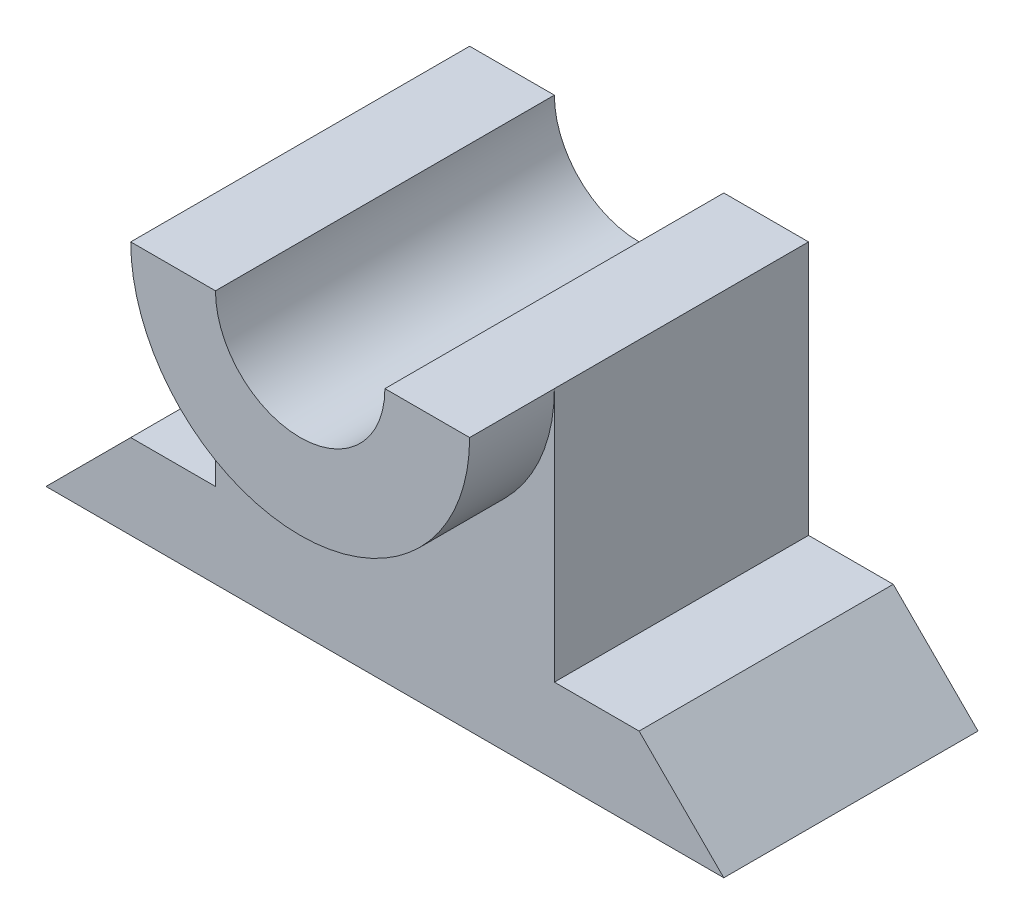
ISO-10303-21;
HEADER;
FILE_DESCRIPTION(('STEP AP214'),'2;1');
FILE_NAME('part.step','',(''),(''),'','','');
FILE_SCHEMA(('AUTOMOTIVE_DESIGN { 1 0 10303 214 1 1 1 1 }'));
ENDSEC;
DATA;
#1=APPLICATION_CONTEXT('core data for automotive mechanical design processes');
#2=APPLICATION_PROTOCOL_DEFINITION('international standard','automotive_design',2000,#1);
#3=PRODUCT_CONTEXT('',#1,'mechanical');
#4=PRODUCT('Part','Part','',(#3));
#5=PRODUCT_RELATED_PRODUCT_CATEGORY('part','',(#4));
#6=PRODUCT_DEFINITION_FORMATION('','',#4);
#7=PRODUCT_DEFINITION_CONTEXT('part definition',#1,'design');
#8=PRODUCT_DEFINITION('design','',#6,#7);
#9=PRODUCT_DEFINITION_SHAPE('','',#8);
#10=(LENGTH_UNIT() NAMED_UNIT(*) SI_UNIT(.MILLI.,.METRE.));
#11=(NAMED_UNIT(*) PLANE_ANGLE_UNIT() SI_UNIT($,.RADIAN.));
#12=(NAMED_UNIT(*) SI_UNIT($,.STERADIAN.) SOLID_ANGLE_UNIT());
#13=UNCERTAINTY_MEASURE_WITH_UNIT(LENGTH_MEASURE(1.E-05),#10,'distance_accuracy_value','');
#14=(GEOMETRIC_REPRESENTATION_CONTEXT(3) GLOBAL_UNCERTAINTY_ASSIGNED_CONTEXT((#13)) GLOBAL_UNIT_ASSIGNED_CONTEXT((#10,
#11,#12)) REPRESENTATION_CONTEXT('',''));
#15=CARTESIAN_POINT('',(0.,0.,0.));
#16=DIRECTION('',(0.,0.,1.));
#17=DIRECTION('',(1.,0.,0.));
#18=AXIS2_PLACEMENT_3D('',#15,#16,#17);
#19=CARTESIAN_POINT('',(0.,1016.,1016.));
#20=DIRECTION('',(0.,0.,-1.));
#21=DIRECTION('',(-1.,0.,0.));
#22=AXIS2_PLACEMENT_3D('',#19,#20,#21);
#23=CYLINDRICAL_SURFACE('',#22,508.);
#24=CARTESIAN_POINT('',(0.,1016.,762.));
#25=DIRECTION('',(0.,0.,1.));
#26=DIRECTION('',(1.,0.,0.));
#27=AXIS2_PLACEMENT_3D('',#24,#25,#26);
#28=CIRCLE('',#27,508.);
#29=CARTESIAN_POINT('',(508.,1016.,762.));
#30=VERTEX_POINT('',#29);
#31=CARTESIAN_POINT('',(-508.,1016.,762.));
#32=VERTEX_POINT('',#31);
#33=EDGE_CURVE('E188',#30,#32,#28,.F.);
#34=ORIENTED_EDGE('',*,*,#33,.F.);
#35=DIRECTION('',(0.,0.,-1.));
#36=VECTOR('',#35,1.);
#37=CARTESIAN_POINT('',(508.,1016.,1016.));
#38=LINE('',#37,#36);
#39=CARTESIAN_POINT('',(508.,1016.,1016.));
#40=VERTEX_POINT('',#39);
#41=EDGE_CURVE('E11',#40,#30,#38,.T.);
#42=ORIENTED_EDGE('',*,*,#41,.F.);
#43=CARTESIAN_POINT('',(0.,1016.,1016.));
#44=DIRECTION('',(0.,0.,1.));
#45=DIRECTION('',(1.,0.,0.));
#46=AXIS2_PLACEMENT_3D('',#43,#44,#45);
#47=CIRCLE('',#46,508.);
#48=CARTESIAN_POINT('',(-508.,1016.,1016.));
#49=VERTEX_POINT('',#48);
#50=EDGE_CURVE('E159',#40,#49,#47,.F.);
#51=ORIENTED_EDGE('',*,*,#50,.T.);
#52=DIRECTION('',(0.,0.,-1.));
#53=VECTOR('',#52,1.);
#54=CARTESIAN_POINT('',(-508.,1016.,1016.));
#55=LINE('',#54,#53);
#56=EDGE_CURVE('E49',#49,#32,#55,.T.);
#57=ORIENTED_EDGE('',*,*,#56,.T.);
#58=EDGE_LOOP('',(#34,#42,#51,#57));
#59=FACE_BOUND('',#58,.T.);
#60=ADVANCED_FACE('F33',(#59),#23,.T.);
#61=CARTESIAN_POINT('',(2.66453525910038E-12,1016.,1016.));
#62=DIRECTION('',(0.,-1.,0.));
#63=DIRECTION('',(1.,0.,0.));
#64=AXIS2_PLACEMENT_3D('',#61,#62,#63);
#65=PLANE('',#64);
#66=DIRECTION('',(-1.,0.,0.));
#67=VECTOR('',#66,1.);
#68=CARTESIAN_POINT('',(2.66453525910038E-12,1016.,0.));
#69=LINE('',#68,#67);
#70=CARTESIAN_POINT('',(508.,1016.,0.));
#71=VERTEX_POINT('',#70);
#72=CARTESIAN_POINT('',(254.,1016.,0.));
#73=VERTEX_POINT('',#72);
#74=EDGE_CURVE('E151',#71,#73,#69,.T.);
#75=ORIENTED_EDGE('',*,*,#74,.T.);
#76=DIRECTION('',(0.,0.,-1.));
#77=VECTOR('',#76,1.);
#78=CARTESIAN_POINT('',(254.,1016.,1016.));
#79=LINE('',#78,#77);
#80=CARTESIAN_POINT('',(254.,1016.,1016.));
#81=VERTEX_POINT('',#80);
#82=EDGE_CURVE('E41',#81,#73,#79,.T.);
#83=ORIENTED_EDGE('',*,*,#82,.F.);
#84=DIRECTION('',(-1.,0.,0.));
#85=VECTOR('',#84,1.);
#86=CARTESIAN_POINT('',(2.66453525910038E-12,1016.,1016.));
#87=LINE('',#86,#85);
#88=EDGE_CURVE('E161',#40,#81,#87,.T.);
#89=ORIENTED_EDGE('',*,*,#88,.F.);
#90=ORIENTED_EDGE('',*,*,#41,.T.);
#91=DIRECTION('',(0.,0.,-1.));
#92=VECTOR('',#91,1.);
#93=CARTESIAN_POINT('',(508.,1016.,762.));
#94=LINE('',#93,#92);
#95=EDGE_CURVE('E185',#30,#71,#94,.T.);
#96=ORIENTED_EDGE('',*,*,#95,.T.);
#97=EDGE_LOOP('',(#75,#83,#89,#90,#96));
#98=FACE_BOUND('',#97,.T.);
#99=ADVANCED_FACE('F193',(#98),#65,.F.);
#100=CARTESIAN_POINT('',(0.,1016.,1016.));
#101=DIRECTION('',(0.,0.,-1.));
#102=DIRECTION('',(-1.,0.,0.));
#103=AXIS2_PLACEMENT_3D('',#100,#101,#102);
#104=CYLINDRICAL_SURFACE('',#103,254.);
#105=CARTESIAN_POINT('',(0.,1016.,0.));
#106=DIRECTION('',(0.,0.,1.));
#107=DIRECTION('',(1.,0.,0.));
#108=AXIS2_PLACEMENT_3D('',#105,#106,#107);
#109=CIRCLE('',#108,254.);
#110=CARTESIAN_POINT('',(-254.,1016.,0.));
#111=VERTEX_POINT('',#110);
#112=EDGE_CURVE('E153',#73,#111,#109,.F.);
#113=ORIENTED_EDGE('',*,*,#112,.T.);
#114=DIRECTION('',(0.,0.,-1.));
#115=VECTOR('',#114,1.);
#116=CARTESIAN_POINT('',(-254.,1016.,1016.));
#117=LINE('',#116,#115);
#118=CARTESIAN_POINT('',(-254.,1016.,1016.));
#119=VERTEX_POINT('',#118);
#120=EDGE_CURVE('E63',#119,#111,#117,.T.);
#121=ORIENTED_EDGE('',*,*,#120,.F.);
#122=CARTESIAN_POINT('',(0.,1016.,1016.));
#123=DIRECTION('',(0.,0.,1.));
#124=DIRECTION('',(1.,0.,0.));
#125=AXIS2_PLACEMENT_3D('',#122,#123,#124);
#126=CIRCLE('',#125,254.);
#127=EDGE_CURVE('E164',#81,#119,#126,.F.);
#128=ORIENTED_EDGE('',*,*,#127,.F.);
#129=ORIENTED_EDGE('',*,*,#82,.T.);
#130=EDGE_LOOP('',(#113,#121,#128,#129));
#131=FACE_BOUND('',#130,.T.);
#132=ADVANCED_FACE('F176',(#131),#104,.F.);
#133=CARTESIAN_POINT('',(-1.77635683940025E-12,1016.,1016.));
#134=DIRECTION('',(0.,1.,0.));
#135=DIRECTION('',(-1.,0.,0.));
#136=AXIS2_PLACEMENT_3D('',#133,#134,#135);
#137=PLANE('',#136);
#138=DIRECTION('',(1.,0.,0.));
#139=VECTOR('',#138,1.);
#140=CARTESIAN_POINT('',(-1.77635683940025E-12,1016.,0.));
#141=LINE('',#140,#139);
#142=CARTESIAN_POINT('',(-508.,1016.,0.));
#143=VERTEX_POINT('',#142);
#144=EDGE_CURVE('E162',#143,#111,#141,.T.);
#145=ORIENTED_EDGE('',*,*,#144,.F.);
#146=DIRECTION('',(0.,0.,-1.));
#147=VECTOR('',#146,1.);
#148=CARTESIAN_POINT('',(-508.,1016.,762.));
#149=LINE('',#148,#147);
#150=EDGE_CURVE('E182',#32,#143,#149,.T.);
#151=ORIENTED_EDGE('',*,*,#150,.F.);
#152=ORIENTED_EDGE('',*,*,#56,.F.);
#153=DIRECTION('',(1.,0.,0.));
#154=VECTOR('',#153,1.);
#155=CARTESIAN_POINT('',(-1.77635683940025E-12,1016.,1016.));
#156=LINE('',#155,#154);
#157=EDGE_CURVE('E166',#49,#119,#156,.T.);
#158=ORIENTED_EDGE('',*,*,#157,.T.);
#159=ORIENTED_EDGE('',*,*,#120,.T.);
#160=EDGE_LOOP('',(#145,#151,#152,#158,#159));
#161=FACE_BOUND('',#160,.T.);
#162=ADVANCED_FACE('F181',(#161),#137,.T.);
#163=CARTESIAN_POINT('',(0.,0.,1016.));
#164=DIRECTION('',(0.,0.,1.));
#165=DIRECTION('',(1.,0.,0.));
#166=AXIS2_PLACEMENT_3D('',#163,#164,#165);
#167=PLANE('',#166);
#168=ORIENTED_EDGE('',*,*,#50,.F.);
#169=ORIENTED_EDGE('',*,*,#88,.T.);
#170=ORIENTED_EDGE('',*,*,#127,.T.);
#171=ORIENTED_EDGE('',*,*,#157,.F.);
#172=EDGE_LOOP('',(#168,#169,#170,#171));
#173=FACE_BOUND('',#172,.T.);
#174=ADVANCED_FACE('F192',(#173),#167,.T.);
#175=CARTESIAN_POINT('',(0.,0.,0.));
#176=DIRECTION('',(0.,0.,1.));
#177=DIRECTION('',(1.,0.,0.));
#178=AXIS2_PLACEMENT_3D('',#175,#176,#177);
#179=PLANE('',#178);
#180=ORIENTED_EDGE('',*,*,#74,.F.);
#181=DIRECTION('',(0.,1.,0.));
#182=VECTOR('',#181,1.);
#183=CARTESIAN_POINT('',(508.,0.,0.));
#184=LINE('',#183,#182);
#185=CARTESIAN_POINT('',(508.,254.,0.));
#186=VERTEX_POINT('',#185);
#187=EDGE_CURVE('E211',#186,#71,#184,.T.);
#188=ORIENTED_EDGE('',*,*,#187,.F.);
#189=DIRECTION('',(-1.,0.,0.));
#190=VECTOR('',#189,1.);
#191=CARTESIAN_POINT('',(0.,254.,0.));
#192=LINE('',#191,#190);
#193=CARTESIAN_POINT('',(761.999999999997,254.,0.));
#194=VERTEX_POINT('',#193);
#195=EDGE_CURVE('E213',#194,#186,#192,.T.);
#196=ORIENTED_EDGE('',*,*,#195,.F.);
#197=DIRECTION('',(-0.707106781186551,0.707106781186544,0.));
#198=VECTOR('',#197,1.);
#199=CARTESIAN_POINT('',(507.999999999995,508.,0.));
#200=LINE('',#199,#198);
#201=CARTESIAN_POINT('',(1016.,0.,0.));
#202=VERTEX_POINT('',#201);
#203=EDGE_CURVE('E215',#202,#194,#200,.T.);
#204=ORIENTED_EDGE('',*,*,#203,.F.);
#205=DIRECTION('',(1.,0.,0.));
#206=VECTOR('',#205,1.);
#207=CARTESIAN_POINT('',(0.,0.,0.));
#208=LINE('',#207,#206);
#209=CARTESIAN_POINT('',(-1016.,0.,0.));
#210=VERTEX_POINT('',#209);
#211=EDGE_CURVE('E150',#210,#202,#208,.T.);
#212=ORIENTED_EDGE('',*,*,#211,.F.);
#213=DIRECTION('',(0.707106781186551,0.707106781186544,0.));
#214=VECTOR('',#213,1.);
#215=CARTESIAN_POINT('',(-507.999999999995,508.,0.));
#216=LINE('',#215,#214);
#217=CARTESIAN_POINT('',(-761.999999999997,254.,0.));
#218=VERTEX_POINT('',#217);
#219=EDGE_CURVE('E146',#210,#218,#216,.T.);
#220=ORIENTED_EDGE('',*,*,#219,.T.);
#221=DIRECTION('',(1.,0.,0.));
#222=VECTOR('',#221,1.);
#223=CARTESIAN_POINT('',(0.,254.,0.));
#224=LINE('',#223,#222);
#225=CARTESIAN_POINT('',(-508.,254.,0.));
#226=VERTEX_POINT('',#225);
#227=EDGE_CURVE('E208',#218,#226,#224,.T.);
#228=ORIENTED_EDGE('',*,*,#227,.T.);
#229=DIRECTION('',(0.,1.,0.));
#230=VECTOR('',#229,1.);
#231=CARTESIAN_POINT('',(-508.,0.,0.));
#232=LINE('',#231,#230);
#233=EDGE_CURVE('E71',#226,#143,#232,.T.);
#234=ORIENTED_EDGE('',*,*,#233,.T.);
#235=ORIENTED_EDGE('',*,*,#144,.T.);
#236=ORIENTED_EDGE('',*,*,#112,.F.);
#237=EDGE_LOOP('',(#180,#188,#196,#204,#212,#220,#228,#234,#235,#236));
#238=FACE_BOUND('',#237,.T.);
#239=ADVANCED_FACE('F179',(#238),#179,.F.);
#240=CARTESIAN_POINT('',(0.,0.,762.));
#241=DIRECTION('',(0.,1.,0.));
#242=DIRECTION('',(0.,0.,1.));
#243=AXIS2_PLACEMENT_3D('',#240,#241,#242);
#244=PLANE('',#243);
#245=ORIENTED_EDGE('',*,*,#211,.T.);
#246=DIRECTION('',(0.,0.,-1.));
#247=VECTOR('',#246,1.);
#248=CARTESIAN_POINT('',(1016.,0.,762.));
#249=LINE('',#248,#247);
#250=CARTESIAN_POINT('',(1016.,0.,762.));
#251=VERTEX_POINT('',#250);
#252=EDGE_CURVE('E130',#251,#202,#249,.T.);
#253=ORIENTED_EDGE('',*,*,#252,.F.);
#254=DIRECTION('',(1.,0.,0.));
#255=VECTOR('',#254,1.);
#256=CARTESIAN_POINT('',(0.,0.,762.));
#257=LINE('',#256,#255);
#258=CARTESIAN_POINT('',(-1016.,0.,762.));
#259=VERTEX_POINT('',#258);
#260=EDGE_CURVE('E137',#259,#251,#257,.T.);
#261=ORIENTED_EDGE('',*,*,#260,.F.);
#262=DIRECTION('',(0.,0.,-1.));
#263=VECTOR('',#262,1.);
#264=CARTESIAN_POINT('',(-1016.,0.,762.));
#265=LINE('',#264,#263);
#266=EDGE_CURVE('E204',#259,#210,#265,.T.);
#267=ORIENTED_EDGE('',*,*,#266,.T.);
#268=EDGE_LOOP('',(#245,#253,#261,#267));
#269=FACE_BOUND('',#268,.T.);
#270=ADVANCED_FACE('F148',(#269),#244,.F.);
#271=CARTESIAN_POINT('',(507.999999999995,508.,762.));
#272=DIRECTION('',(-0.707106781186544,-0.707106781186551,0.));
#273=DIRECTION('',(0.707106781186551,-0.707106781186544,0.));
#274=AXIS2_PLACEMENT_3D('',#271,#272,#273);
#275=PLANE('',#274);
#276=ORIENTED_EDGE('',*,*,#203,.T.);
#277=DIRECTION('',(0.,0.,-1.));
#278=VECTOR('',#277,1.);
#279=CARTESIAN_POINT('',(761.999999999997,254.,762.));
#280=LINE('',#279,#278);
#281=CARTESIAN_POINT('',(761.999999999997,254.,762.));
#282=VERTEX_POINT('',#281);
#283=EDGE_CURVE('E133',#282,#194,#280,.T.);
#284=ORIENTED_EDGE('',*,*,#283,.F.);
#285=DIRECTION('',(-0.707106781186551,0.707106781186544,0.));
#286=VECTOR('',#285,1.);
#287=CARTESIAN_POINT('',(507.999999999995,508.,762.));
#288=LINE('',#287,#286);
#289=EDGE_CURVE('E126',#251,#282,#288,.T.);
#290=ORIENTED_EDGE('',*,*,#289,.F.);
#291=ORIENTED_EDGE('',*,*,#252,.T.);
#292=EDGE_LOOP('',(#276,#284,#290,#291));
#293=FACE_BOUND('',#292,.T.);
#294=ADVANCED_FACE('F128',(#293),#275,.F.);
#295=CARTESIAN_POINT('',(0.,254.,762.));
#296=DIRECTION('',(0.,-1.,0.));
#297=DIRECTION('',(0.,0.,-1.));
#298=AXIS2_PLACEMENT_3D('',#295,#296,#297);
#299=PLANE('',#298);
#300=ORIENTED_EDGE('',*,*,#195,.T.);
#301=DIRECTION('',(0.,0.,-1.));
#302=VECTOR('',#301,1.);
#303=CARTESIAN_POINT('',(508.,254.,762.));
#304=LINE('',#303,#302);
#305=CARTESIAN_POINT('',(508.,254.,762.));
#306=VERTEX_POINT('',#305);
#307=EDGE_CURVE('E155',#306,#186,#304,.T.);
#308=ORIENTED_EDGE('',*,*,#307,.F.);
#309=DIRECTION('',(-1.,0.,0.));
#310=VECTOR('',#309,1.);
#311=CARTESIAN_POINT('',(0.,254.,762.));
#312=LINE('',#311,#310);
#313=EDGE_CURVE('E136',#282,#306,#312,.T.);
#314=ORIENTED_EDGE('',*,*,#313,.F.);
#315=ORIENTED_EDGE('',*,*,#283,.T.);
#316=EDGE_LOOP('',(#300,#308,#314,#315));
#317=FACE_BOUND('',#316,.T.);
#318=ADVANCED_FACE('F229',(#317),#299,.F.);
#319=CARTESIAN_POINT('',(508.,0.,762.));
#320=DIRECTION('',(-1.,0.,0.));
#321=DIRECTION('',(0.,0.,1.));
#322=AXIS2_PLACEMENT_3D('',#319,#320,#321);
#323=PLANE('',#322);
#324=ORIENTED_EDGE('',*,*,#187,.T.);
#325=ORIENTED_EDGE('',*,*,#95,.F.);
#326=DIRECTION('',(0.,1.,0.));
#327=VECTOR('',#326,1.);
#328=CARTESIAN_POINT('',(508.,0.,762.));
#329=LINE('',#328,#327);
#330=EDGE_CURVE('E225',#306,#30,#329,.T.);
#331=ORIENTED_EDGE('',*,*,#330,.F.);
#332=ORIENTED_EDGE('',*,*,#307,.T.);
#333=EDGE_LOOP('',(#324,#325,#331,#332));
#334=FACE_BOUND('',#333,.T.);
#335=ADVANCED_FACE('F231',(#334),#323,.F.);
#336=CARTESIAN_POINT('',(-508.,0.,762.));
#337=DIRECTION('',(-1.,0.,0.));
#338=DIRECTION('',(0.,0.,1.));
#339=AXIS2_PLACEMENT_3D('',#336,#337,#338);
#340=PLANE('',#339);
#341=ORIENTED_EDGE('',*,*,#233,.F.);
#342=DIRECTION('',(0.,0.,-1.));
#343=VECTOR('',#342,1.);
#344=CARTESIAN_POINT('',(-508.,254.,762.));
#345=LINE('',#344,#343);
#346=CARTESIAN_POINT('',(-508.,254.,762.));
#347=VERTEX_POINT('',#346);
#348=EDGE_CURVE('E186',#347,#226,#345,.T.);
#349=ORIENTED_EDGE('',*,*,#348,.F.);
#350=DIRECTION('',(0.,1.,0.));
#351=VECTOR('',#350,1.);
#352=CARTESIAN_POINT('',(-508.,0.,762.));
#353=LINE('',#352,#351);
#354=EDGE_CURVE('E222',#347,#32,#353,.T.);
#355=ORIENTED_EDGE('',*,*,#354,.T.);
#356=ORIENTED_EDGE('',*,*,#150,.T.);
#357=EDGE_LOOP('',(#341,#349,#355,#356));
#358=FACE_BOUND('',#357,.T.);
#359=ADVANCED_FACE('F233',(#358),#340,.T.);
#360=CARTESIAN_POINT('',(0.,254.,762.));
#361=DIRECTION('',(0.,1.,0.));
#362=DIRECTION('',(0.,0.,1.));
#363=AXIS2_PLACEMENT_3D('',#360,#361,#362);
#364=PLANE('',#363);
#365=ORIENTED_EDGE('',*,*,#227,.F.);
#366=DIRECTION('',(0.,0.,-1.));
#367=VECTOR('',#366,1.);
#368=CARTESIAN_POINT('',(-761.999999999997,254.,762.));
#369=LINE('',#368,#367);
#370=CARTESIAN_POINT('',(-761.999999999997,254.,762.));
#371=VERTEX_POINT('',#370);
#372=EDGE_CURVE('E202',#371,#218,#369,.T.);
#373=ORIENTED_EDGE('',*,*,#372,.F.);
#374=DIRECTION('',(1.,0.,0.));
#375=VECTOR('',#374,1.);
#376=CARTESIAN_POINT('',(0.,254.,762.));
#377=LINE('',#376,#375);
#378=EDGE_CURVE('E219',#371,#347,#377,.T.);
#379=ORIENTED_EDGE('',*,*,#378,.T.);
#380=ORIENTED_EDGE('',*,*,#348,.T.);
#381=EDGE_LOOP('',(#365,#373,#379,#380));
#382=FACE_BOUND('',#381,.T.);
#383=ADVANCED_FACE('F239',(#382),#364,.T.);
#384=CARTESIAN_POINT('',(-507.999999999995,508.,762.));
#385=DIRECTION('',(-0.707106781186544,0.707106781186551,0.));
#386=DIRECTION('',(-0.707106781186551,-0.707106781186544,0.));
#387=AXIS2_PLACEMENT_3D('',#384,#385,#386);
#388=PLANE('',#387);
#389=ORIENTED_EDGE('',*,*,#219,.F.);
#390=ORIENTED_EDGE('',*,*,#266,.F.);
#391=DIRECTION('',(0.707106781186551,0.707106781186544,0.));
#392=VECTOR('',#391,1.);
#393=CARTESIAN_POINT('',(-507.999999999995,508.,762.));
#394=LINE('',#393,#392);
#395=EDGE_CURVE('E144',#259,#371,#394,.T.);
#396=ORIENTED_EDGE('',*,*,#395,.T.);
#397=ORIENTED_EDGE('',*,*,#372,.T.);
#398=EDGE_LOOP('',(#389,#390,#396,#397));
#399=FACE_BOUND('',#398,.T.);
#400=ADVANCED_FACE('F287',(#399),#388,.T.);
#401=CARTESIAN_POINT('',(0.,0.,762.));
#402=DIRECTION('',(0.,0.,1.));
#403=DIRECTION('',(1.,0.,0.));
#404=AXIS2_PLACEMENT_3D('',#401,#402,#403);
#405=PLANE('',#404);
#406=ORIENTED_EDGE('',*,*,#260,.T.);
#407=ORIENTED_EDGE('',*,*,#289,.T.);
#408=ORIENTED_EDGE('',*,*,#313,.T.);
#409=ORIENTED_EDGE('',*,*,#330,.T.);
#410=ORIENTED_EDGE('',*,*,#33,.T.);
#411=ORIENTED_EDGE('',*,*,#354,.F.);
#412=ORIENTED_EDGE('',*,*,#378,.F.);
#413=ORIENTED_EDGE('',*,*,#395,.F.);
#414=EDGE_LOOP('',(#406,#407,#408,#409,#410,#411,#412,#413));
#415=FACE_BOUND('',#414,.T.);
#416=ADVANCED_FACE('F141',(#415),#405,.T.);
#417=CLOSED_SHELL('',(#60,#99,#132,#162,#174,#239,#270,#294,#318,#335,#359,#383,#400,#416));
#418=MANIFOLD_SOLID_BREP('B2',#417);
#419=ADVANCED_BREP_SHAPE_REPRESENTATION('',(#18,#418),#14);
#420=SHAPE_DEFINITION_REPRESENTATION(#9,#419);
ENDSEC;
END-ISO-10303-21;
